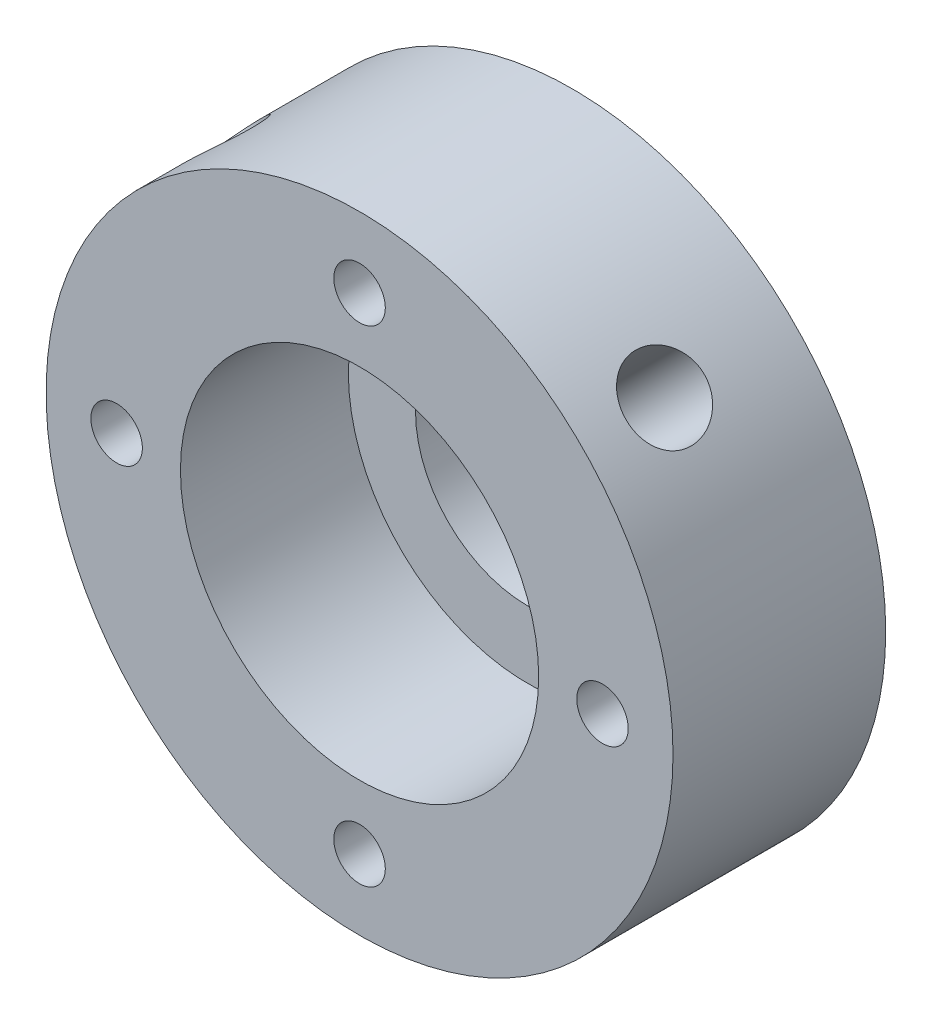
ISO-10303-21;
HEADER;
FILE_DESCRIPTION(('STEP AP214'),'2;1');
FILE_NAME('part.step','',(''),(''),'','','');
FILE_SCHEMA(('AUTOMOTIVE_DESIGN { 1 0 10303 214 1 1 1 1 }'));
ENDSEC;
DATA;
#1=APPLICATION_CONTEXT('core data for automotive mechanical design processes');
#2=APPLICATION_PROTOCOL_DEFINITION('international standard','automotive_design',2000,#1);
#3=PRODUCT_CONTEXT('',#1,'mechanical');
#4=PRODUCT('Part','Part','',(#3));
#5=PRODUCT_RELATED_PRODUCT_CATEGORY('part','',(#4));
#6=PRODUCT_DEFINITION_FORMATION('','',#4);
#7=PRODUCT_DEFINITION_CONTEXT('part definition',#1,'design');
#8=PRODUCT_DEFINITION('design','',#6,#7);
#9=PRODUCT_DEFINITION_SHAPE('','',#8);
#10=(LENGTH_UNIT() NAMED_UNIT(*) SI_UNIT(.MILLI.,.METRE.));
#11=(NAMED_UNIT(*) PLANE_ANGLE_UNIT() SI_UNIT($,.RADIAN.));
#12=(NAMED_UNIT(*) SI_UNIT($,.STERADIAN.) SOLID_ANGLE_UNIT());
#13=UNCERTAINTY_MEASURE_WITH_UNIT(LENGTH_MEASURE(1.E-05),#10,'distance_accuracy_value','');
#14=(GEOMETRIC_REPRESENTATION_CONTEXT(3) GLOBAL_UNCERTAINTY_ASSIGNED_CONTEXT((#13)) GLOBAL_UNIT_ASSIGNED_CONTEXT((#10,
#11,#12)) REPRESENTATION_CONTEXT('',''));
#15=CARTESIAN_POINT('',(0.,0.,0.));
#16=DIRECTION('',(0.,0.,1.));
#17=DIRECTION('',(1.,0.,0.));
#18=AXIS2_PLACEMENT_3D('',#15,#16,#17);
#19=CARTESIAN_POINT('',(0.,0.,2.));
#20=DIRECTION('',(0.,0.,-1.));
#21=DIRECTION('',(-1.,0.,0.));
#22=AXIS2_PLACEMENT_3D('',#19,#20,#21);
#23=CYLINDRICAL_SURFACE('',#22,14.);
#24=CARTESIAN_POINT('',(-11.0592875073581,8.58441377320512,5.75));
#25=CARTESIAN_POINT('',(-11.0592855589211,8.58441771018223,5.65211460134572));
#26=CARTESIAN_POINT('',(-11.0542001654367,8.59098021668698,5.55416802456663));
#27=CARTESIAN_POINT('',(-11.0339326687549,8.61699432920575,5.36100074221677));
#28=CARTESIAN_POINT('',(-11.0187400148505,8.63645940379871,5.26578299365207));
#29=CARTESIAN_POINT('',(-10.9785311882833,8.68751414802832,5.08089808251878));
#30=CARTESIAN_POINT('',(-10.9535216827794,8.71909558845237,4.99122720051694));
#31=CARTESIAN_POINT('',(-10.8941271060131,8.7931927373625,4.81989008372384));
#32=CARTESIAN_POINT('',(-10.8597436375035,8.83570657656516,4.73822248377986));
#33=CARTESIAN_POINT('',(-10.7820294866255,8.93037504061943,4.58473642701451));
#34=CARTESIAN_POINT('',(-10.7386549432799,8.98257678994448,4.51296923837678));
#35=CARTESIAN_POINT('',(-10.6439011144411,9.09465464754733,4.38176406174265));
#36=CARTESIAN_POINT('',(-10.5925214309282,9.15453113739092,4.32232668713372));
#37=CARTESIAN_POINT('',(-10.4826466017527,9.28014521992979,4.21728449434554));
#38=CARTESIAN_POINT('',(-10.424128488121,9.34590153969116,4.17172606843024));
#39=CARTESIAN_POINT('',(-10.301458527151,9.48094213828875,4.09603216004132));
#40=CARTESIAN_POINT('',(-10.23730688901,9.55022628608123,4.06589610515144));
#41=CARTESIAN_POINT('',(-10.1053338354276,9.68975730689718,4.0220555521659));
#42=CARTESIAN_POINT('',(-10.0375333989839,9.75999723756417,4.00826582503328));
#43=CARTESIAN_POINT('',(-9.89979880060828,9.89967683815098,3.99724523047442));
#44=CARTESIAN_POINT('',(-9.82986472272337,9.96911653944487,4.00001371163322));
#45=CARTESIAN_POINT('',(-9.69028455865742,10.1048410246416,4.0219626419302));
#46=CARTESIAN_POINT('',(-9.62063904289272,10.1711412504686,4.04105142893696));
#47=CARTESIAN_POINT('',(-9.48334907378324,10.2992675886158,4.09495582364095));
#48=CARTESIAN_POINT('',(-9.4157046585062,10.3610936158537,4.12977173031678));
#49=CARTESIAN_POINT('',(-9.2843669324,10.4789477132399,4.21423954494865));
#50=CARTESIAN_POINT('',(-9.22068474264436,10.5349597350704,4.26393112041113));
#51=CARTESIAN_POINT('',(-9.09954755719382,10.6397678543135,4.37671085355122));
#52=CARTESIAN_POINT('',(-9.04209284727547,10.6885636206126,4.439799625628));
#53=CARTESIAN_POINT('',(-8.93498746393012,10.7782615721969,4.57809627301887));
#54=CARTESIAN_POINT('',(-8.88539281263153,10.8191075278302,4.65338403168266));
#55=CARTESIAN_POINT('',(-8.79624961824873,10.891708231941,4.81366708974771));
#56=CARTESIAN_POINT('',(-8.75670110665467,10.9234629519216,4.89866241957664));
#57=CARTESIAN_POINT('',(-8.6891002488769,10.9773136341209,5.07601864689363));
#58=CARTESIAN_POINT('',(-8.66105279028707,10.9994054901849,5.16838265596724));
#59=CARTESIAN_POINT('',(-8.61756022116898,11.033513799299,5.35781761746878));
#60=CARTESIAN_POINT('',(-8.6021145032958,11.0455307379138,5.4548883428161));
#61=CARTESIAN_POINT('',(-8.58449476243216,11.0592303312236,5.65028022739984));
#62=CARTESIAN_POINT('',(-8.58223192424446,11.0609821442008,5.74858853616216));
#63=CARTESIAN_POINT('',(-8.59082945024889,11.0543058495819,5.94427935076579));
#64=CARTESIAN_POINT('',(-8.60168953472678,11.0458779589655,6.04166187629552));
#65=CARTESIAN_POINT('',(-8.63604665114041,11.0190365260655,6.2324020345045));
#66=CARTESIAN_POINT('',(-8.65950095238133,11.0006567476126,6.32577213063329));
#67=CARTESIAN_POINT('',(-8.71812384950223,10.954255146006,6.50622690839721));
#68=CARTESIAN_POINT('',(-8.75329285695445,10.9262329840856,6.59331136906861));
#69=CARTESIAN_POINT('',(-8.83426339300528,10.8608701992697,6.7592282506691));
#70=CARTESIAN_POINT('',(-8.88012008906368,10.8234811488997,6.8380146657201));
#71=CARTESIAN_POINT('',(-8.98072362980795,10.7401517003047,6.98462958775452));
#72=CARTESIAN_POINT('',(-9.03547082029052,10.6942109694511,7.05245766830759));
#73=CARTESIAN_POINT('',(-9.152305367655,10.5943962512693,7.17562293113408));
#74=CARTESIAN_POINT('',(-9.21443278413978,10.5404785376658,7.2308867127565));
#75=CARTESIAN_POINT('',(-9.34368707500626,10.4260707086251,7.32684675234366));
#76=CARTESIAN_POINT('',(-9.41081384858413,10.3655807256956,7.36754330393668));
#77=CARTESIAN_POINT('',(-9.54770106328009,10.2396300822277,7.43309245083562));
#78=CARTESIAN_POINT('',(-9.61745391582343,10.1741832628361,7.45798746722213));
#79=CARTESIAN_POINT('',(-9.75758641395909,10.0398666089808,7.49136486245873));
#80=CARTESIAN_POINT('',(-9.82796603114306,9.97099692901811,7.49984798141946));
#81=CARTESIAN_POINT('',(-9.96678351803119,9.83223237120012,7.50014694560451));
#82=CARTESIAN_POINT('',(-10.0352313513107,9.76234767725432,7.49207597239758));
#83=CARTESIAN_POINT('',(-10.1687939429678,9.62314591740449,7.45973557059842));
#84=CARTESIAN_POINT('',(-10.2339087036635,9.55382885110573,7.43546615327177));
#85=CARTESIAN_POINT('',(-10.3591217029429,9.41791589386505,7.37145331995521));
#86=CARTESIAN_POINT('',(-10.4192216898466,9.35131905872688,7.33171532443874));
#87=CARTESIAN_POINT('',(-10.5330318316626,9.2229392676423,7.23790507977471));
#88=CARTESIAN_POINT('',(-10.5867419105995,9.16115636893617,7.18383266021682));
#89=CARTESIAN_POINT('',(-10.6869595209451,9.04405244031378,7.06246974926453));
#90=CARTESIAN_POINT('',(-10.733417599931,8.98877636001255,6.99509504453344));
#91=CARTESIAN_POINT('',(-10.8177932267859,8.88705402374405,6.84921493917979));
#92=CARTESIAN_POINT('',(-10.8557087490116,8.84060986244107,6.77070690575637));
#93=CARTESIAN_POINT('',(-10.9224064600287,8.75807469221114,6.60444105411185));
#94=CARTESIAN_POINT('',(-10.9511528135076,8.72202435631507,6.51664868704544));
#95=CARTESIAN_POINT('',(-10.9987664681822,8.66190625724268,6.33460028158367));
#96=CARTESIAN_POINT('',(-11.0176445145888,8.63782546231484,6.24035140048762));
#97=CARTESIAN_POINT('',(-11.0406957269628,8.60832458708988,6.07967900906953));
#98=CARTESIAN_POINT('',(-11.0476611510808,8.59937445978017,6.0142689339237));
#99=CARTESIAN_POINT('',(-11.0569576836076,8.58741774198286,5.88258192502315));
#100=CARTESIAN_POINT('',(-11.0592888271781,8.58441110640023,5.81630499784933));
#101=CARTESIAN_POINT('',(-11.0592875073581,8.58441377320512,5.75));
#102=B_SPLINE_CURVE_WITH_KNOTS('',3,(#24,#25,#26,#27,#28,#29,#30,#31,#32,#33,#34,#35,#36,#37,
#38,#39,#40,#41,#42,#43,#44,#45,#46,#47,#48,#49,#50,#51,#52,#53,#54,#55,#56,#57,#58,#59,#60,#61,
#62,#63,#64,#65,#66,#67,#68,#69,#70,#71,#72,#73,#74,#75,#76,#77,#78,#79,#80,#81,#82,#83,#84,#85,
#86,#87,#88,#89,#90,#91,#92,#93,#94,#95,#96,#97,#98,#99,#100,#101),.UNSPECIFIED.,.T.,.F.,(4,2,2,
2,2,2,2,2,2,2,2,2,2,2,2,2,2,2,2,2,2,2,2,2,2,2,2,2,2,2,2,2,2,2,2,2,2,2,4),(0.,0.293413972235467,
0.587134713306668,0.880656316806842,1.17412776565429,1.46906604284346,1.76401898919805,
2.05994730302019,2.35586463237881,2.6502321785902,2.94458814419076,3.23730165453127,
3.53002072970253,3.82352743088963,4.11704759528374,4.41257388164439,4.70810109433598,
5.00375376717306,5.29939219009332,5.59303652464118,5.88667460028981,6.17932263404913,
6.47198095048297,6.76618473680878,7.06039996896368,7.3562922012464,7.65217846896215,
7.94726699749459,8.24234221840969,8.53540671401779,8.82847100580752,9.12143269480863,
9.41439786674974,9.70928090223586,10.0042337880788,10.3003256839338,10.5960945018741,
10.7948469274306,10.9935978449883),.UNSPECIFIED.);
#103=CARTESIAN_POINT('',(-11.0592875073581,8.58441377320512,5.75));
#104=VERTEX_POINT('',#103);
#105=EDGE_CURVE('E65',#104,#104,#102,.T.);
#106=ORIENTED_EDGE('',*,*,#105,.T.);
#107=EDGE_LOOP('',(#106));
#108=FACE_BOUND('',#107,.T.);
#109=CARTESIAN_POINT('',(8.58441377320512,11.0592875073581,5.75));
#110=CARTESIAN_POINT('',(8.58441771018223,11.0592855589211,5.65211460134572));
#111=CARTESIAN_POINT('',(8.59098021668698,11.0542001654367,5.55416802456663));
#112=CARTESIAN_POINT('',(8.61699432920575,11.0339326687549,5.36100074221677));
#113=CARTESIAN_POINT('',(8.63645940379871,11.0187400148505,5.26578299365207));
#114=CARTESIAN_POINT('',(8.68751414802832,10.9785311882833,5.08089808251878));
#115=CARTESIAN_POINT('',(8.71909558845237,10.9535216827794,4.99122720051694));
#116=CARTESIAN_POINT('',(8.7931927373625,10.8941271060131,4.81989008372384));
#117=CARTESIAN_POINT('',(8.83570657656516,10.8597436375035,4.73822248377986));
#118=CARTESIAN_POINT('',(8.93037504061943,10.7820294866255,4.58473642701451));
#119=CARTESIAN_POINT('',(8.98257678994448,10.7386549432799,4.51296923837678));
#120=CARTESIAN_POINT('',(9.09465464754733,10.6439011144411,4.38176406174265));
#121=CARTESIAN_POINT('',(9.15453113739092,10.5925214309282,4.32232668713372));
#122=CARTESIAN_POINT('',(9.28014521992978,10.4826466017527,4.21728449434554));
#123=CARTESIAN_POINT('',(9.34590153969116,10.424128488121,4.17172606843024));
#124=CARTESIAN_POINT('',(9.48094213828875,10.301458527151,4.09603216004132));
#125=CARTESIAN_POINT('',(9.55022628608123,10.23730688901,4.06589610515144));
#126=CARTESIAN_POINT('',(9.68975730689718,10.1053338354276,4.0220555521659));
#127=CARTESIAN_POINT('',(9.75999723756417,10.0375333989839,4.00826582503328));
#128=CARTESIAN_POINT('',(9.89967683815098,9.89979880060828,3.99724523047442));
#129=CARTESIAN_POINT('',(9.96911653944487,9.82986472272337,4.00001371163322));
#130=CARTESIAN_POINT('',(10.1048410246416,9.69028455865742,4.0219626419302));
#131=CARTESIAN_POINT('',(10.1711412504686,9.62063904289272,4.04105142893696));
#132=CARTESIAN_POINT('',(10.2992675886158,9.48334907378324,4.09495582364095));
#133=CARTESIAN_POINT('',(10.3610936158537,9.4157046585062,4.12977173031678));
#134=CARTESIAN_POINT('',(10.4789477132399,9.2843669324,4.21423954494865));
#135=CARTESIAN_POINT('',(10.5349597350704,9.22068474264436,4.26393112041113));
#136=CARTESIAN_POINT('',(10.6397678543135,9.09954755719382,4.37671085355122));
#137=CARTESIAN_POINT('',(10.6885636206126,9.04209284727547,4.439799625628));
#138=CARTESIAN_POINT('',(10.7782615721969,8.93498746393012,4.57809627301887));
#139=CARTESIAN_POINT('',(10.8191075278302,8.88539281263153,4.65338403168267));
#140=CARTESIAN_POINT('',(10.891708231941,8.79624961824873,4.81366708974772));
#141=CARTESIAN_POINT('',(10.9234629519216,8.75670110665467,4.89866241957664));
#142=CARTESIAN_POINT('',(10.9773136341209,8.6891002488769,5.07601864689363));
#143=CARTESIAN_POINT('',(10.9994054901849,8.66105279028707,5.16838265596724));
#144=CARTESIAN_POINT('',(11.033513799299,8.61756022116898,5.35781761746878));
#145=CARTESIAN_POINT('',(11.0455307379138,8.6021145032958,5.45488834281611));
#146=CARTESIAN_POINT('',(11.0592303312236,8.58449476243216,5.65028022739984));
#147=CARTESIAN_POINT('',(11.0609821442008,8.58223192424446,5.74858853616216));
#148=CARTESIAN_POINT('',(11.0543058495819,8.59082945024889,5.94427935076579));
#149=CARTESIAN_POINT('',(11.0458779589655,8.60168953472678,6.04166187629552));
#150=CARTESIAN_POINT('',(11.0190365260655,8.63604665114042,6.23240203450451));
#151=CARTESIAN_POINT('',(11.0006567476126,8.65950095238134,6.32577213063329));
#152=CARTESIAN_POINT('',(10.954255146006,8.71812384950223,6.50622690839721));
#153=CARTESIAN_POINT('',(10.9262329840856,8.75329285695445,6.59331136906861));
#154=CARTESIAN_POINT('',(10.8608701992697,8.83426339300528,6.7592282506691));
#155=CARTESIAN_POINT('',(10.8234811488997,8.88012008906368,6.8380146657201));
#156=CARTESIAN_POINT('',(10.7401517003047,8.98072362980795,6.98462958775452));
#157=CARTESIAN_POINT('',(10.6942109694511,9.03547082029053,7.05245766830759));
#158=CARTESIAN_POINT('',(10.5943962512693,9.152305367655,7.17562293113408));
#159=CARTESIAN_POINT('',(10.5404785376658,9.21443278413978,7.2308867127565));
#160=CARTESIAN_POINT('',(10.4260707086251,9.34368707500626,7.32684675234366));
#161=CARTESIAN_POINT('',(10.3655807256956,9.41081384858413,7.36754330393668));
#162=CARTESIAN_POINT('',(10.2396300822277,9.54770106328009,7.43309245083562));
#163=CARTESIAN_POINT('',(10.1741832628361,9.61745391582343,7.45798746722213));
#164=CARTESIAN_POINT('',(10.0398666089808,9.75758641395909,7.49136486245873));
#165=CARTESIAN_POINT('',(9.97099692901811,9.82796603114306,7.49984798141946));
#166=CARTESIAN_POINT('',(9.83223237120012,9.96678351803119,7.50014694560451));
#167=CARTESIAN_POINT('',(9.76234767725432,10.0352313513107,7.49207597239758));
#168=CARTESIAN_POINT('',(9.62314591740449,10.1687939429678,7.45973557059841));
#169=CARTESIAN_POINT('',(9.55382885110573,10.2339087036635,7.43546615327177));
#170=CARTESIAN_POINT('',(9.41791589386505,10.3591217029429,7.37145331995521));
#171=CARTESIAN_POINT('',(9.35131905872688,10.4192216898466,7.33171532443874));
#172=CARTESIAN_POINT('',(9.2229392676423,10.5330318316626,7.23790507977471));
#173=CARTESIAN_POINT('',(9.16115636893617,10.5867419105995,7.18383266021681));
#174=CARTESIAN_POINT('',(9.04405244031377,10.6869595209451,7.06246974926453));
#175=CARTESIAN_POINT('',(8.98877636001254,10.733417599931,6.99509504453344));
#176=CARTESIAN_POINT('',(8.88705402374405,10.8177932267859,6.84921493917979));
#177=CARTESIAN_POINT('',(8.84060986244107,10.8557087490116,6.77070690575636));
#178=CARTESIAN_POINT('',(8.75807469221113,10.9224064600287,6.60444105411184));
#179=CARTESIAN_POINT('',(8.72202435631506,10.9511528135076,6.51664868704543));
#180=CARTESIAN_POINT('',(8.66190625724268,10.9987664681822,6.33460028158366));
#181=CARTESIAN_POINT('',(8.63782546231484,11.0176445145888,6.24035140048762));
#182=CARTESIAN_POINT('',(8.60832458708988,11.0406957269628,6.07967900906952));
#183=CARTESIAN_POINT('',(8.59937445978017,11.0476611510808,6.0142689339237));
#184=CARTESIAN_POINT('',(8.58741774198286,11.0569576836076,5.88258192502315));
#185=CARTESIAN_POINT('',(8.58441110640023,11.0592888271781,5.81630499784933));
#186=CARTESIAN_POINT('',(8.58441377320512,11.0592875073581,5.75));
#187=B_SPLINE_CURVE_WITH_KNOTS('',3,(#109,#110,#111,#112,#113,#114,#115,#116,#117,#118,#119,
#120,#121,#122,#123,#124,#125,#126,#127,#128,#129,#130,#131,#132,#133,#134,#135,#136,#137,#138,
#139,#140,#141,#142,#143,#144,#145,#146,#147,#148,#149,#150,#151,#152,#153,#154,#155,#156,#157,
#158,#159,#160,#161,#162,#163,#164,#165,#166,#167,#168,#169,#170,#171,#172,#173,#174,#175,#176,
#177,#178,#179,#180,#181,#182,#183,#184,#185,#186),.UNSPECIFIED.,.T.,.F.,(4,2,2,2,2,2,2,2,2,2,2,
2,2,2,2,2,2,2,2,2,2,2,2,2,2,2,2,2,2,2,2,2,2,2,2,2,2,2,4),(0.,0.293413972235466,
0.587134713306667,0.880656316806841,1.17412776565429,1.46906604284346,1.76401898919805,
2.05994730302018,2.35586463237881,2.6502321785902,2.94458814419076,3.23730165453127,
3.53002072970253,3.82352743088963,4.11704759528373,4.41257388164439,4.70810109433598,
5.00375376717306,5.29939219009332,5.59303652464118,5.88667460028981,6.17932263404913,
6.47198095048297,6.76618473680878,7.06039996896368,7.3562922012464,7.65217846896215,
7.94726699749458,8.24234221840968,8.53540671401779,8.82847100580752,9.12143269480863,
9.41439786674974,9.70928090223585,10.0042337880788,10.3003256839338,10.5960945018741,
10.7948469274306,10.9935978449883),.UNSPECIFIED.);
#188=CARTESIAN_POINT('',(8.58441377320512,11.0592875073581,5.75));
#189=VERTEX_POINT('',#188);
#190=EDGE_CURVE('E64',#189,#189,#187,.T.);
#191=ORIENTED_EDGE('',*,*,#190,.T.);
#192=EDGE_LOOP('',(#191));
#193=FACE_BOUND('',#192,.T.);
#194=CARTESIAN_POINT('',(0.,0.,0.));
#195=DIRECTION('',(0.,0.,1.));
#196=DIRECTION('',(1.,0.,0.));
#197=AXIS2_PLACEMENT_3D('',#194,#195,#196);
#198=CIRCLE('',#197,14.);
#199=CARTESIAN_POINT('',(14.,0.,0.));
#200=VERTEX_POINT('',#199);
#201=EDGE_CURVE('E50',#200,#200,#198,.T.);
#202=ORIENTED_EDGE('',*,*,#201,.T.);
#203=EDGE_LOOP('',(#202));
#204=FACE_BOUND('',#203,.T.);
#205=CARTESIAN_POINT('',(0.,0.,9.5));
#206=DIRECTION('',(0.,0.,1.));
#207=DIRECTION('',(1.,0.,0.));
#208=AXIS2_PLACEMENT_3D('',#205,#206,#207);
#209=CIRCLE('',#208,14.);
#210=CARTESIAN_POINT('',(14.,0.,9.5));
#211=VERTEX_POINT('',#210);
#212=EDGE_CURVE('E55',#211,#211,#209,.T.);
#213=ORIENTED_EDGE('',*,*,#212,.F.);
#214=EDGE_LOOP('',(#213));
#215=FACE_BOUND('',#214,.T.);
#216=ADVANCED_FACE('F37',(#108,#193,#204,#215),#23,.T.);
#217=CARTESIAN_POINT('',(0.,0.,0.));
#218=DIRECTION('',(0.,0.,1.));
#219=DIRECTION('',(1.,0.,0.));
#220=AXIS2_PLACEMENT_3D('',#217,#218,#219);
#221=PLANE('',#220);
#222=CARTESIAN_POINT('',(0.,10.85,0.));
#223=DIRECTION('',(0.,0.,1.));
#224=DIRECTION('',(1.,0.,0.));
#225=AXIS2_PLACEMENT_3D('',#222,#223,#224);
#226=CIRCLE('',#225,1.15);
#227=CARTESIAN_POINT('',(1.15,10.85,0.));
#228=VERTEX_POINT('',#227);
#229=EDGE_CURVE('E91',#228,#228,#226,.T.);
#230=ORIENTED_EDGE('',*,*,#229,.T.);
#231=EDGE_LOOP('',(#230));
#232=FACE_BOUND('',#231,.T.);
#233=CARTESIAN_POINT('',(10.85,0.,0.));
#234=DIRECTION('',(0.,0.,1.));
#235=DIRECTION('',(1.,0.,0.));
#236=AXIS2_PLACEMENT_3D('',#233,#234,#235);
#237=CIRCLE('',#236,1.15);
#238=CARTESIAN_POINT('',(12.,0.,0.));
#239=VERTEX_POINT('',#238);
#240=EDGE_CURVE('E101',#239,#239,#237,.T.);
#241=ORIENTED_EDGE('',*,*,#240,.T.);
#242=EDGE_LOOP('',(#241));
#243=FACE_BOUND('',#242,.T.);
#244=CARTESIAN_POINT('',(0.,-10.85,0.));
#245=DIRECTION('',(0.,0.,1.));
#246=DIRECTION('',(1.,0.,0.));
#247=AXIS2_PLACEMENT_3D('',#244,#245,#246);
#248=CIRCLE('',#247,1.15);
#249=CARTESIAN_POINT('',(1.15,-10.85,0.));
#250=VERTEX_POINT('',#249);
#251=EDGE_CURVE('E107',#250,#250,#248,.T.);
#252=ORIENTED_EDGE('',*,*,#251,.T.);
#253=EDGE_LOOP('',(#252));
#254=FACE_BOUND('',#253,.T.);
#255=CARTESIAN_POINT('',(-10.85,0.,0.));
#256=DIRECTION('',(0.,0.,1.));
#257=DIRECTION('',(1.,0.,0.));
#258=AXIS2_PLACEMENT_3D('',#255,#256,#257);
#259=CIRCLE('',#258,1.15);
#260=CARTESIAN_POINT('',(-9.7,0.,0.));
#261=VERTEX_POINT('',#260);
#262=EDGE_CURVE('E87',#261,#261,#259,.T.);
#263=ORIENTED_EDGE('',*,*,#262,.T.);
#264=EDGE_LOOP('',(#263));
#265=FACE_BOUND('',#264,.T.);
#266=CARTESIAN_POINT('',(0.,0.,0.));
#267=DIRECTION('',(0.,0.,-1.));
#268=DIRECTION('',(-1.,0.,0.));
#269=AXIS2_PLACEMENT_3D('',#266,#267,#268);
#270=CIRCLE('',#269,5.);
#271=CARTESIAN_POINT('',(-5.,0.,0.));
#272=VERTEX_POINT('',#271);
#273=EDGE_CURVE('E94',#272,#272,#270,.T.);
#274=ORIENTED_EDGE('',*,*,#273,.F.);
#275=EDGE_LOOP('',(#274));
#276=FACE_BOUND('',#275,.T.);
#277=ORIENTED_EDGE('',*,*,#201,.F.);
#278=EDGE_LOOP('',(#277));
#279=FACE_BOUND('',#278,.T.);
#280=ADVANCED_FACE('F129',(#232,#243,#254,#265,#276,#279),#221,.F.);
#281=CARTESIAN_POINT('',(0.,0.,9.5));
#282=DIRECTION('',(0.,0.,1.));
#283=DIRECTION('',(1.,0.,0.));
#284=AXIS2_PLACEMENT_3D('',#281,#282,#283);
#285=PLANE('',#284);
#286=CARTESIAN_POINT('',(0.,10.85,9.5));
#287=DIRECTION('',(0.,0.,1.));
#288=DIRECTION('',(1.,0.,0.));
#289=AXIS2_PLACEMENT_3D('',#286,#287,#288);
#290=CIRCLE('',#289,1.15);
#291=CARTESIAN_POINT('',(1.15,10.85,9.5));
#292=VERTEX_POINT('',#291);
#293=EDGE_CURVE('E95',#292,#292,#290,.T.);
#294=ORIENTED_EDGE('',*,*,#293,.F.);
#295=EDGE_LOOP('',(#294));
#296=FACE_BOUND('',#295,.T.);
#297=CARTESIAN_POINT('',(10.85,0.,9.5));
#298=DIRECTION('',(0.,0.,1.));
#299=DIRECTION('',(1.,0.,0.));
#300=AXIS2_PLACEMENT_3D('',#297,#298,#299);
#301=CIRCLE('',#300,1.15);
#302=CARTESIAN_POINT('',(12.,0.,9.5));
#303=VERTEX_POINT('',#302);
#304=EDGE_CURVE('E98',#303,#303,#301,.T.);
#305=ORIENTED_EDGE('',*,*,#304,.F.);
#306=EDGE_LOOP('',(#305));
#307=FACE_BOUND('',#306,.T.);
#308=CARTESIAN_POINT('',(0.,-10.85,9.5));
#309=DIRECTION('',(0.,0.,1.));
#310=DIRECTION('',(1.,0.,0.));
#311=AXIS2_PLACEMENT_3D('',#308,#309,#310);
#312=CIRCLE('',#311,1.15);
#313=CARTESIAN_POINT('',(1.15,-10.85,9.5));
#314=VERTEX_POINT('',#313);
#315=EDGE_CURVE('E104',#314,#314,#312,.T.);
#316=ORIENTED_EDGE('',*,*,#315,.F.);
#317=EDGE_LOOP('',(#316));
#318=FACE_BOUND('',#317,.T.);
#319=CARTESIAN_POINT('',(-10.85,0.,9.5));
#320=DIRECTION('',(0.,0.,1.));
#321=DIRECTION('',(1.,0.,0.));
#322=AXIS2_PLACEMENT_3D('',#319,#320,#321);
#323=CIRCLE('',#322,1.15);
#324=CARTESIAN_POINT('',(-9.7,0.,9.5));
#325=VERTEX_POINT('',#324);
#326=EDGE_CURVE('E110',#325,#325,#323,.T.);
#327=ORIENTED_EDGE('',*,*,#326,.F.);
#328=EDGE_LOOP('',(#327));
#329=FACE_BOUND('',#328,.T.);
#330=ORIENTED_EDGE('',*,*,#212,.T.);
#331=EDGE_LOOP('',(#330));
#332=FACE_BOUND('',#331,.T.);
#333=CARTESIAN_POINT('',(0.,0.,9.5));
#334=DIRECTION('',(0.,0.,1.));
#335=DIRECTION('',(1.,0.,0.));
#336=AXIS2_PLACEMENT_3D('',#333,#334,#335);
#337=CIRCLE('',#336,8.);
#338=CARTESIAN_POINT('',(8.,0.,9.5));
#339=VERTEX_POINT('',#338);
#340=EDGE_CURVE('E118',#339,#339,#337,.T.);
#341=ORIENTED_EDGE('',*,*,#340,.F.);
#342=EDGE_LOOP('',(#341));
#343=FACE_BOUND('',#342,.T.);
#344=ADVANCED_FACE('F125',(#296,#307,#318,#329,#332,#343),#285,.T.);
#345=CARTESIAN_POINT('',(0.,0.,9.5));
#346=DIRECTION('',(0.,0.,-1.));
#347=DIRECTION('',(-1.,0.,0.));
#348=AXIS2_PLACEMENT_3D('',#345,#346,#347);
#349=CYLINDRICAL_SURFACE('',#348,8.);
#350=CARTESIAN_POINT('',(-6.75728740853137,4.28241367437843,5.75));
#351=CARTESIAN_POINT('',(-6.7572864358189,4.28241742043915,5.6529719865672));
#352=CARTESIAN_POINT('',(-6.75285509491892,4.28943219210488,5.55590386868923));
#353=CARTESIAN_POINT('',(-6.73515694329336,4.31716593041878,5.36452809547803));
#354=CARTESIAN_POINT('',(-6.72188374551932,4.33789480358069,5.2702224871333));
#355=CARTESIAN_POINT('',(-6.68662088146166,4.39205386093303,5.08716775159997));
#356=CARTESIAN_POINT('',(-6.66464077981807,4.42547010622337,4.99841265057484));
#357=CARTESIAN_POINT('',(-6.6121370674966,4.50353711713558,4.82873191615454));
#358=CARTESIAN_POINT('',(-6.58161363249329,4.54818765174743,4.74780612181319));
#359=CARTESIAN_POINT('',(-6.5117506986383,4.64767071106652,4.59471253780589));
#360=CARTESIAN_POINT('',(-6.47228443683237,4.70264747442849,4.52269629807493));
#361=CARTESIAN_POINT('',(-6.38521848127704,4.82019972127882,4.39079338749152));
#362=CARTESIAN_POINT('',(-6.33761815575134,4.88277579489965,4.33090765961146));
#363=CARTESIAN_POINT('',(-6.23438082445478,5.0139328586227,4.22436623233176));
#364=CARTESIAN_POINT('',(-6.17866456268551,5.08257008051205,4.17785629524105));
#365=CARTESIAN_POINT('',(-6.06058047843026,5.22281107829635,4.10032973697399));
#366=CARTESIAN_POINT('',(-5.99821340344953,5.29441452025671,4.06931137687435));
#367=CARTESIAN_POINT('',(-5.86926128775424,5.43699018131876,4.0241251174166));
#368=CARTESIAN_POINT('',(-5.80275767898808,5.50795470371953,4.00970073060677));
#369=CARTESIAN_POINT('',(-5.66643300556401,5.64810486238766,3.99730994048858));
#370=CARTESIAN_POINT('',(-5.59661232141431,5.7172907012948,3.99934165397865));
#371=CARTESIAN_POINT('',(-5.45694065885707,5.85072421217797,4.01961437044523));
#372=CARTESIAN_POINT('',(-5.38711042051306,5.91503588865531,4.03757891107517));
#373=CARTESIAN_POINT('',(-5.2484313985945,6.03842596202248,4.0887667801185));
#374=CARTESIAN_POINT('',(-5.17958265954779,6.09750412211241,4.12199079855425));
#375=CARTESIAN_POINT('',(-5.04462045156653,6.2096349145785,4.2029990480669));
#376=CARTESIAN_POINT('',(-4.97853069129534,6.26264027931818,4.25088806992256));
#377=CARTESIAN_POINT('',(-4.85187975514392,6.36126682027887,4.35978878699777));
#378=CARTESIAN_POINT('',(-4.7913193341689,6.40688698887505,4.42080227025849));
#379=CARTESIAN_POINT('',(-4.6767093904802,6.49103666483952,4.55572505085902));
#380=CARTESIAN_POINT('',(-4.62282160112356,6.52939884402311,4.62987630560751));
#381=CARTESIAN_POINT('',(-4.52519370150899,6.59743687627675,4.78817892039438));
#382=CARTESIAN_POINT('',(-4.48145386643818,6.6271124937947,4.87233055152438));
#383=CARTESIAN_POINT('',(-4.40587953681626,6.67759738871819,5.04862144608706));
#384=CARTESIAN_POINT('',(-4.37408071094507,6.69838012782498,5.14078364370769));
#385=CARTESIAN_POINT('',(-4.32406351384026,6.73077796444658,5.33025868273823));
#386=CARTESIAN_POINT('',(-4.30584298783509,6.74239451658183,5.42757070428457));
#387=CARTESIAN_POINT('',(-4.28410636016127,6.75622653145643,5.6224569275024));
#388=CARTESIAN_POINT('',(-4.28029798613782,6.75862886838208,5.7199853182606));
#389=CARTESIAN_POINT('',(-4.28676262845681,6.75453036478645,5.9143807036213));
#390=CARTESIAN_POINT('',(-4.29703467722516,6.74803013602893,6.01124774321065));
#391=CARTESIAN_POINT('',(-4.33095199526394,6.72631015249794,6.20039091520493));
#392=CARTESIAN_POINT('',(-4.3544374889898,6.71119454594867,6.29270782401673));
#393=CARTESIAN_POINT('',(-4.41359430759669,6.67243793646259,6.4714579700726));
#394=CARTESIAN_POINT('',(-4.44926679906692,6.64879611734983,6.55789064310333));
#395=CARTESIAN_POINT('',(-4.53192156437374,6.59273913643557,6.72388497843437));
#396=CARTESIAN_POINT('',(-4.57906951618442,6.56019449772474,6.80332035921827));
#397=CARTESIAN_POINT('',(-4.68248056226202,6.48678561819451,6.95173168369394));
#398=CARTESIAN_POINT('',(-4.73874478865659,6.4459203438939,7.02070632623003));
#399=CARTESIAN_POINT('',(-4.85940010318161,6.35547083683945,7.14755337012295));
#400=CARTESIAN_POINT('',(-4.92392316242068,6.30573823908874,7.20519478022894));
#401=CARTESIAN_POINT('',(-5.05786425533932,6.19881772864504,7.30608724272948));
#402=CARTESIAN_POINT('',(-5.12728206021031,6.14163016433416,7.349338967241));
#403=CARTESIAN_POINT('',(-5.26809773476028,6.0212674911324,7.41990264693481));
#404=CARTESIAN_POINT('',(-5.33947995074544,5.95813336776877,7.44731558387298));
#405=CARTESIAN_POINT('',(-5.48223283765318,5.82704937705271,7.4857388611449));
#406=CARTESIAN_POINT('',(-5.55360350874495,5.7591002114348,7.49675158648308));
#407=CARTESIAN_POINT('',(-5.69260216321536,5.62171092173696,7.50195457827283));
#408=CARTESIAN_POINT('',(-5.76027710418475,5.55233113744565,7.49648972318037));
#409=CARTESIAN_POINT('',(-5.89156954835449,5.4128168134945,7.46966411740783));
#410=CARTESIAN_POINT('',(-5.95518712449669,5.34268228742965,7.44830365258081));
#411=CARTESIAN_POINT('',(-6.07664791203298,5.2041156005644,7.39045845606348));
#412=CARTESIAN_POINT('',(-6.13450905774763,5.1356786852191,7.35402264734774));
#413=CARTESIAN_POINT('',(-6.24357328681382,5.0025202413903,7.26710874006052));
#414=CARTESIAN_POINT('',(-6.29477572302233,4.93779907437181,7.21662927811655));
#415=CARTESIAN_POINT('',(-6.39064384827594,4.81310512931095,7.10193650784483));
#416=CARTESIAN_POINT('',(-6.43516700216799,4.7532458099922,7.03748068449274));
#417=CARTESIAN_POINT('',(-6.51595605704299,4.64188119877392,6.89715399963899));
#418=CARTESIAN_POINT('',(-6.55221996499043,4.59037792412896,6.82128039023581));
#419=CARTESIAN_POINT('',(-6.61655938010037,4.49715481968186,6.6590516072625));
#420=CARTESIAN_POINT('',(-6.64451888710902,4.45557504840139,6.57256982229047));
#421=CARTESIAN_POINT('',(-6.69133209768394,4.38496104880476,6.39237797670048));
#422=CARTESIAN_POINT('',(-6.71019350772666,4.35591620507398,6.29867411180724));
#423=CARTESIAN_POINT('',(-6.73537258309256,4.31684547391851,6.12906263930061));
#424=CARTESIAN_POINT('',(-6.74358595705933,4.30396939286267,6.05407494852323));
#425=CARTESIAN_POINT('',(-6.7545436193223,4.28675222671176,5.90273307766719));
#426=CARTESIAN_POINT('',(-6.75728817423572,4.28241072553687,5.82637896438781));
#427=CARTESIAN_POINT('',(-6.75728740853137,4.28241367437843,5.75));
#428=B_SPLINE_CURVE_WITH_KNOTS('',3,(#350,#351,#352,#353,#354,#355,#356,#357,#358,#359,#360,
#361,#362,#363,#364,#365,#366,#367,#368,#369,#370,#371,#372,#373,#374,#375,#376,#377,#378,#379,
#380,#381,#382,#383,#384,#385,#386,#387,#388,#389,#390,#391,#392,#393,#394,#395,#396,#397,#398,
#399,#400,#401,#402,#403,#404,#405,#406,#407,#408,#409,#410,#411,#412,#413,#414,#415,#416,#417,
#418,#419,#420,#421,#422,#423,#424,#425,#426,#427),.UNSPECIFIED.,.T.,.F.,(4,2,2,2,2,2,2,2,2,2,2,
2,2,2,2,2,2,2,2,2,2,2,2,2,2,2,2,2,2,2,2,2,2,2,2,2,2,2,4),(0.,0.290804115870691,
0.581818526599535,0.872514137052688,1.16320377043854,1.45830491896335,1.75342899855111,
2.05165686348641,2.34985124493559,2.64337184515389,2.93685885596571,3.2253508676411,
3.51385592599757,3.8044726414071,4.09512897475707,4.39183436537594,4.68854780096224,
4.98614062158782,5.28368620646371,5.57516431760517,5.86662240004893,6.15462969113393,
6.44266455918166,6.7351342450112,7.02764027980829,7.32560034403599,7.62354648911712,
7.91957146995089,8.21555339708043,8.50538367763981,8.79520874626514,9.08410055231566,
9.37302041407615,9.66742474155351,9.96190003653334,10.2603137141584,10.5584741768494,
10.7874018788084,11.0163184197546),.UNSPECIFIED.);
#429=CARTESIAN_POINT('',(-6.75728740853137,4.28241367437843,5.75));
#430=VERTEX_POINT('',#429);
#431=EDGE_CURVE('E41',#430,#430,#428,.T.);
#432=ORIENTED_EDGE('',*,*,#431,.F.);
#433=EDGE_LOOP('',(#432));
#434=FACE_BOUND('',#433,.T.);
#435=CARTESIAN_POINT('',(4.28241367437843,6.75728740853137,5.75));
#436=CARTESIAN_POINT('',(4.28241742043916,6.7572864358189,5.6529719865672));
#437=CARTESIAN_POINT('',(4.28943219210489,6.75285509491892,5.55590386868923));
#438=CARTESIAN_POINT('',(4.31716593041878,6.73515694329336,5.36452809547803));
#439=CARTESIAN_POINT('',(4.33789480358069,6.72188374551932,5.2702224871333));
#440=CARTESIAN_POINT('',(4.39205386093303,6.68662088146166,5.08716775159997));
#441=CARTESIAN_POINT('',(4.42547010622338,6.66464077981807,4.99841265057484));
#442=CARTESIAN_POINT('',(4.50353711713558,6.6121370674966,4.82873191615454));
#443=CARTESIAN_POINT('',(4.54818765174744,6.58161363249329,4.74780612181319));
#444=CARTESIAN_POINT('',(4.64767071106652,6.5117506986383,4.59471253780589));
#445=CARTESIAN_POINT('',(4.70264747442849,6.47228443683237,4.52269629807493));
#446=CARTESIAN_POINT('',(4.82019972127882,6.38521848127704,4.39079338749152));
#447=CARTESIAN_POINT('',(4.88277579489965,6.33761815575134,4.33090765961146));
#448=CARTESIAN_POINT('',(5.0139328586227,6.23438082445478,4.22436623233177));
#449=CARTESIAN_POINT('',(5.08257008051205,6.17866456268551,4.17785629524105));
#450=CARTESIAN_POINT('',(5.22281107829635,6.06058047843026,4.10032973697399));
#451=CARTESIAN_POINT('',(5.29441452025671,5.99821340344953,4.06931137687435));
#452=CARTESIAN_POINT('',(5.43699018131876,5.86926128775424,4.0241251174166));
#453=CARTESIAN_POINT('',(5.50795470371953,5.80275767898808,4.00970073060678));
#454=CARTESIAN_POINT('',(5.64810486238766,5.66643300556401,3.99730994048858));
#455=CARTESIAN_POINT('',(5.7172907012948,5.59661232141432,3.99934165397865));
#456=CARTESIAN_POINT('',(5.85072421217797,5.45694065885707,4.01961437044523));
#457=CARTESIAN_POINT('',(5.91503588865531,5.38711042051306,4.03757891107517));
#458=CARTESIAN_POINT('',(6.03842596202248,5.2484313985945,4.0887667801185));
#459=CARTESIAN_POINT('',(6.09750412211241,5.17958265954779,4.12199079855425));
#460=CARTESIAN_POINT('',(6.2096349145785,5.04462045156653,4.2029990480669));
#461=CARTESIAN_POINT('',(6.26264027931818,4.97853069129534,4.25088806992256));
#462=CARTESIAN_POINT('',(6.36126682027887,4.85187975514392,4.35978878699777));
#463=CARTESIAN_POINT('',(6.40688698887505,4.7913193341689,4.42080227025849));
#464=CARTESIAN_POINT('',(6.49103666483952,4.6767093904802,4.55572505085902));
#465=CARTESIAN_POINT('',(6.5293988440231,4.62282160112356,4.62987630560751));
#466=CARTESIAN_POINT('',(6.59743687627675,4.52519370150899,4.78817892039438));
#467=CARTESIAN_POINT('',(6.6271124937947,4.48145386643818,4.87233055152438));
#468=CARTESIAN_POINT('',(6.67759738871819,4.40587953681626,5.04862144608706));
#469=CARTESIAN_POINT('',(6.69838012782498,4.37408071094507,5.14078364370769));
#470=CARTESIAN_POINT('',(6.73077796444658,4.32406351384026,5.33025868273823));
#471=CARTESIAN_POINT('',(6.74239451658183,4.30584298783509,5.42757070428457));
#472=CARTESIAN_POINT('',(6.75622653145643,4.28410636016127,5.6224569275024));
#473=CARTESIAN_POINT('',(6.75862886838208,4.28029798613782,5.71998531826059));
#474=CARTESIAN_POINT('',(6.75453036478645,4.28676262845681,5.9143807036213));
#475=CARTESIAN_POINT('',(6.74803013602893,4.29703467722516,6.01124774321065));
#476=CARTESIAN_POINT('',(6.72631015249794,4.33095199526394,6.20039091520493));
#477=CARTESIAN_POINT('',(6.71119454594867,4.3544374889898,6.29270782401673));
#478=CARTESIAN_POINT('',(6.67243793646259,4.41359430759668,6.4714579700726));
#479=CARTESIAN_POINT('',(6.64879611734983,4.44926679906692,6.55789064310333));
#480=CARTESIAN_POINT('',(6.59273913643557,4.53192156437374,6.72388497843437));
#481=CARTESIAN_POINT('',(6.56019449772474,4.57906951618442,6.80332035921827));
#482=CARTESIAN_POINT('',(6.48678561819451,4.68248056226202,6.95173168369394));
#483=CARTESIAN_POINT('',(6.44592034389391,4.73874478865659,7.02070632623003));
#484=CARTESIAN_POINT('',(6.35547083683945,4.85940010318161,7.14755337012295));
#485=CARTESIAN_POINT('',(6.30573823908874,4.92392316242068,7.20519478022894));
#486=CARTESIAN_POINT('',(6.19881772864504,5.05786425533932,7.30608724272948));
#487=CARTESIAN_POINT('',(6.14163016433417,5.12728206021031,7.349338967241));
#488=CARTESIAN_POINT('',(6.0212674911324,5.26809773476028,7.41990264693481));
#489=CARTESIAN_POINT('',(5.95813336776877,5.33947995074543,7.44731558387298));
#490=CARTESIAN_POINT('',(5.82704937705271,5.48223283765317,7.4857388611449));
#491=CARTESIAN_POINT('',(5.7591002114348,5.55360350874494,7.49675158648308));
#492=CARTESIAN_POINT('',(5.62171092173696,5.69260216321536,7.50195457827283));
#493=CARTESIAN_POINT('',(5.55233113744565,5.76027710418475,7.49648972318037));
#494=CARTESIAN_POINT('',(5.4128168134945,5.89156954835449,7.46966411740783));
#495=CARTESIAN_POINT('',(5.34268228742965,5.95518712449669,7.44830365258081));
#496=CARTESIAN_POINT('',(5.2041156005644,6.07664791203298,7.39045845606348));
#497=CARTESIAN_POINT('',(5.1356786852191,6.13450905774763,7.35402264734775));
#498=CARTESIAN_POINT('',(5.0025202413903,6.24357328681382,7.26710874006052));
#499=CARTESIAN_POINT('',(4.93779907437181,6.29477572302233,7.21662927811655));
#500=CARTESIAN_POINT('',(4.81310512931095,6.39064384827593,7.10193650784483));
#501=CARTESIAN_POINT('',(4.7532458099922,6.43516700216799,7.03748068449274));
#502=CARTESIAN_POINT('',(4.64188119877392,6.51595605704299,6.897153999639));
#503=CARTESIAN_POINT('',(4.59037792412896,6.55221996499043,6.82128039023581));
#504=CARTESIAN_POINT('',(4.49715481968186,6.61655938010037,6.6590516072625));
#505=CARTESIAN_POINT('',(4.45557504840139,6.64451888710902,6.57256982229047));
#506=CARTESIAN_POINT('',(4.38496104880476,6.69133209768394,6.39237797670048));
#507=CARTESIAN_POINT('',(4.35591620507398,6.71019350772666,6.29867411180724));
#508=CARTESIAN_POINT('',(4.31684547391851,6.73537258309256,6.12906263930061));
#509=CARTESIAN_POINT('',(4.30396939286267,6.74358595705933,6.05407494852323));
#510=CARTESIAN_POINT('',(4.28675222671176,6.75454361932229,5.90273307766719));
#511=CARTESIAN_POINT('',(4.28241072553687,6.75728817423571,5.82637896438781));
#512=CARTESIAN_POINT('',(4.28241367437843,6.75728740853137,5.75));
#513=B_SPLINE_CURVE_WITH_KNOTS('',3,(#435,#436,#437,#438,#439,#440,#441,#442,#443,#444,#445,
#446,#447,#448,#449,#450,#451,#452,#453,#454,#455,#456,#457,#458,#459,#460,#461,#462,#463,#464,
#465,#466,#467,#468,#469,#470,#471,#472,#473,#474,#475,#476,#477,#478,#479,#480,#481,#482,#483,
#484,#485,#486,#487,#488,#489,#490,#491,#492,#493,#494,#495,#496,#497,#498,#499,#500,#501,#502,
#503,#504,#505,#506,#507,#508,#509,#510,#511,#512),.UNSPECIFIED.,.T.,.F.,(4,2,2,2,2,2,2,2,2,2,2,
2,2,2,2,2,2,2,2,2,2,2,2,2,2,2,2,2,2,2,2,2,2,2,2,2,2,2,4),(0.,0.290804115870692,
0.581818526599534,0.872514137052688,1.16320377043854,1.45830491896335,1.75342899855111,
2.05165686348641,2.34985124493558,2.64337184515389,2.93685885596571,3.2253508676411,
3.51385592599757,3.8044726414071,4.09512897475707,4.39183436537594,4.68854780096223,
4.98614062158781,5.28368620646371,5.57516431760516,5.86662240004893,6.15462969113392,
6.44266455918165,6.73513424501119,7.02764027980828,7.32560034403598,7.62354648911712,
7.91957146995089,8.21555339708042,8.5053836776398,8.79520874626514,9.08410055231566,
9.37302041407614,9.6674247415535,9.96190003653333,10.2603137141584,10.5584741768494,
10.7874018788084,11.0163184197546),.UNSPECIFIED.);
#514=CARTESIAN_POINT('',(4.28241367437843,6.75728740853137,5.75));
#515=VERTEX_POINT('',#514);
#516=EDGE_CURVE('E58',#515,#515,#513,.T.);
#517=ORIENTED_EDGE('',*,*,#516,.F.);
#518=EDGE_LOOP('',(#517));
#519=FACE_BOUND('',#518,.T.);
#520=ORIENTED_EDGE('',*,*,#340,.T.);
#521=EDGE_LOOP('',(#520));
#522=FACE_BOUND('',#521,.T.);
#523=CARTESIAN_POINT('',(0.,0.,2.));
#524=DIRECTION('',(0.,0.,1.));
#525=DIRECTION('',(1.,0.,0.));
#526=AXIS2_PLACEMENT_3D('',#523,#524,#525);
#527=CIRCLE('',#526,8.);
#528=CARTESIAN_POINT('',(8.,0.,2.));
#529=VERTEX_POINT('',#528);
#530=EDGE_CURVE('E10',#529,#529,#527,.F.);
#531=ORIENTED_EDGE('',*,*,#530,.T.);
#532=EDGE_LOOP('',(#531));
#533=FACE_BOUND('',#532,.T.);
#534=ADVANCED_FACE('F66',(#434,#519,#522,#533),#349,.F.);
#535=CARTESIAN_POINT('',(0.,0.,2.));
#536=DIRECTION('',(0.,0.,1.));
#537=DIRECTION('',(1.,0.,0.));
#538=AXIS2_PLACEMENT_3D('',#535,#536,#537);
#539=PLANE('',#538);
#540=CARTESIAN_POINT('',(0.,0.,2.));
#541=DIRECTION('',(0.,0.,-1.));
#542=DIRECTION('',(-1.,0.,0.));
#543=AXIS2_PLACEMENT_3D('',#540,#541,#542);
#544=CIRCLE('',#543,5.);
#545=CARTESIAN_POINT('',(-5.,0.,2.));
#546=VERTEX_POINT('',#545);
#547=EDGE_CURVE('E115',#546,#546,#544,.T.);
#548=ORIENTED_EDGE('',*,*,#547,.T.);
#549=EDGE_LOOP('',(#548));
#550=FACE_BOUND('',#549,.T.);
#551=ORIENTED_EDGE('',*,*,#530,.F.);
#552=EDGE_LOOP('',(#551));
#553=FACE_BOUND('',#552,.T.);
#554=ADVANCED_FACE('F150',(#550,#553),#539,.T.);
#555=CARTESIAN_POINT('',(0.,0.,2.));
#556=DIRECTION('',(0.,0.,-1.));
#557=DIRECTION('',(-1.,0.,0.));
#558=AXIS2_PLACEMENT_3D('',#555,#556,#557);
#559=CYLINDRICAL_SURFACE('',#558,5.);
#560=ORIENTED_EDGE('',*,*,#547,.F.);
#561=EDGE_LOOP('',(#560));
#562=FACE_BOUND('',#561,.T.);
#563=ORIENTED_EDGE('',*,*,#273,.T.);
#564=EDGE_LOOP('',(#563));
#565=FACE_BOUND('',#564,.T.);
#566=ADVANCED_FACE('F162',(#562,#565),#559,.F.);
#567=CARTESIAN_POINT('',(-10.85,0.,0.));
#568=DIRECTION('',(0.,0.,1.));
#569=DIRECTION('',(1.,0.,0.));
#570=AXIS2_PLACEMENT_3D('',#567,#568,#569);
#571=CYLINDRICAL_SURFACE('',#570,1.15);
#572=ORIENTED_EDGE('',*,*,#262,.F.);
#573=EDGE_LOOP('',(#572));
#574=FACE_BOUND('',#573,.T.);
#575=ORIENTED_EDGE('',*,*,#326,.T.);
#576=EDGE_LOOP('',(#575));
#577=FACE_BOUND('',#576,.T.);
#578=ADVANCED_FACE('F167',(#574,#577),#571,.F.);
#579=CARTESIAN_POINT('',(0.,-10.85,0.));
#580=DIRECTION('',(0.,0.,1.));
#581=DIRECTION('',(1.,0.,0.));
#582=AXIS2_PLACEMENT_3D('',#579,#580,#581);
#583=CYLINDRICAL_SURFACE('',#582,1.15);
#584=ORIENTED_EDGE('',*,*,#251,.F.);
#585=EDGE_LOOP('',(#584));
#586=FACE_BOUND('',#585,.T.);
#587=ORIENTED_EDGE('',*,*,#315,.T.);
#588=EDGE_LOOP('',(#587));
#589=FACE_BOUND('',#588,.T.);
#590=ADVANCED_FACE('F177',(#586,#589),#583,.F.);
#591=CARTESIAN_POINT('',(10.85,0.,0.));
#592=DIRECTION('',(0.,0.,1.));
#593=DIRECTION('',(1.,0.,0.));
#594=AXIS2_PLACEMENT_3D('',#591,#592,#593);
#595=CYLINDRICAL_SURFACE('',#594,1.15);
#596=ORIENTED_EDGE('',*,*,#240,.F.);
#597=EDGE_LOOP('',(#596));
#598=FACE_BOUND('',#597,.T.);
#599=ORIENTED_EDGE('',*,*,#304,.T.);
#600=EDGE_LOOP('',(#599));
#601=FACE_BOUND('',#600,.T.);
#602=ADVANCED_FACE('F182',(#598,#601),#595,.F.);
#603=CARTESIAN_POINT('',(0.,10.85,0.));
#604=DIRECTION('',(0.,0.,1.));
#605=DIRECTION('',(1.,0.,0.));
#606=AXIS2_PLACEMENT_3D('',#603,#604,#605);
#607=CYLINDRICAL_SURFACE('',#606,1.15);
#608=ORIENTED_EDGE('',*,*,#229,.F.);
#609=EDGE_LOOP('',(#608));
#610=FACE_BOUND('',#609,.T.);
#611=ORIENTED_EDGE('',*,*,#293,.T.);
#612=EDGE_LOOP('',(#611));
#613=FACE_BOUND('',#612,.T.);
#614=ADVANCED_FACE('F75',(#610,#613),#607,.F.);
#615=CARTESIAN_POINT('',(4.94974746830582,4.94974746830584,5.75));
#616=DIRECTION('',(0.707106781186546,0.707106781186549,0.));
#617=DIRECTION('',(-0.707106781186549,0.707106781186546,0.));
#618=AXIS2_PLACEMENT_3D('',#615,#616,#617);
#619=CYLINDRICAL_SURFACE('',#618,1.75);
#620=ORIENTED_EDGE('',*,*,#516,.T.);
#621=EDGE_LOOP('',(#620));
#622=FACE_BOUND('',#621,.T.);
#623=ORIENTED_EDGE('',*,*,#190,.F.);
#624=EDGE_LOOP('',(#623));
#625=FACE_BOUND('',#624,.T.);
#626=ADVANCED_FACE('F70',(#622,#625),#619,.F.);
#627=CARTESIAN_POINT('',(-4.94974746830585,4.94974746830582,5.75));
#628=DIRECTION('',(-0.707106781186549,0.707106781186546,0.));
#629=DIRECTION('',(-0.707106781186546,-0.707106781186549,0.));
#630=AXIS2_PLACEMENT_3D('',#627,#628,#629);
#631=CYLINDRICAL_SURFACE('',#630,1.75);
#632=ORIENTED_EDGE('',*,*,#431,.T.);
#633=EDGE_LOOP('',(#632));
#634=FACE_BOUND('',#633,.T.);
#635=ORIENTED_EDGE('',*,*,#105,.F.);
#636=EDGE_LOOP('',(#635));
#637=FACE_BOUND('',#636,.T.);
#638=ADVANCED_FACE('F74',(#634,#637),#631,.F.);
#639=CLOSED_SHELL('',(#216,#280,#344,#534,#554,#566,#578,#590,#602,#614,#626,#638));
#640=MANIFOLD_SOLID_BREP('B2',#639);
#641=ADVANCED_BREP_SHAPE_REPRESENTATION('',(#18,#640),#14);
#642=SHAPE_DEFINITION_REPRESENTATION(#9,#641);
ENDSEC;
END-ISO-10303-21;
